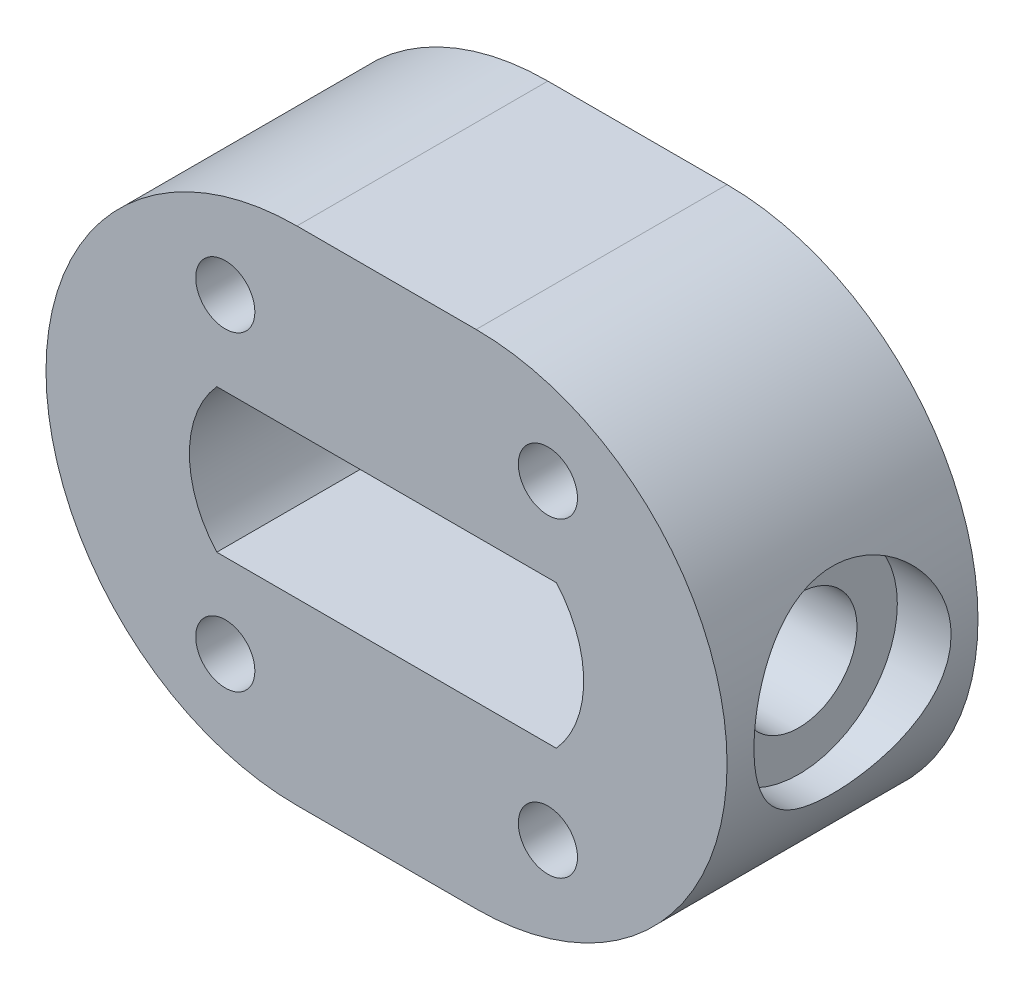
ISO-10303-21;
HEADER;
FILE_DESCRIPTION(('STEP AP214'),'2;1');
FILE_NAME('part.step','',(''),(''),'','','');
FILE_SCHEMA(('AUTOMOTIVE_DESIGN { 1 0 10303 214 1 1 1 1 }'));
ENDSEC;
DATA;
#1=APPLICATION_CONTEXT('core data for automotive mechanical design processes');
#2=APPLICATION_PROTOCOL_DEFINITION('international standard','automotive_design',2000,#1);
#3=PRODUCT_CONTEXT('',#1,'mechanical');
#4=PRODUCT('Part','Part','',(#3));
#5=PRODUCT_RELATED_PRODUCT_CATEGORY('part','',(#4));
#6=PRODUCT_DEFINITION_FORMATION('','',#4);
#7=PRODUCT_DEFINITION_CONTEXT('part definition',#1,'design');
#8=PRODUCT_DEFINITION('design','',#6,#7);
#9=PRODUCT_DEFINITION_SHAPE('','',#8);
#10=(LENGTH_UNIT() NAMED_UNIT(*) SI_UNIT(.MILLI.,.METRE.));
#11=(NAMED_UNIT(*) PLANE_ANGLE_UNIT() SI_UNIT($,.RADIAN.));
#12=(NAMED_UNIT(*) SI_UNIT($,.STERADIAN.) SOLID_ANGLE_UNIT());
#13=UNCERTAINTY_MEASURE_WITH_UNIT(LENGTH_MEASURE(1.E-05),#10,'distance_accuracy_value','');
#14=(GEOMETRIC_REPRESENTATION_CONTEXT(3) GLOBAL_UNCERTAINTY_ASSIGNED_CONTEXT((#13)) GLOBAL_UNIT_ASSIGNED_CONTEXT((#10,
#11,#12)) REPRESENTATION_CONTEXT('',''));
#15=CARTESIAN_POINT('',(0.,0.,0.));
#16=DIRECTION('',(0.,0.,1.));
#17=DIRECTION('',(1.,0.,0.));
#18=AXIS2_PLACEMENT_3D('',#15,#16,#17);
#19=CARTESIAN_POINT('',(-14.001,0.,7.));
#20=DIRECTION('',(1.,0.,0.));
#21=DIRECTION('',(0.,0.,-1.));
#22=AXIS2_PLACEMENT_3D('',#19,#20,#21);
#23=CYLINDRICAL_SURFACE('',#22,3.25);
#24=CARTESIAN_POINT('',(16.,0.,3.75));
#25=CARTESIAN_POINT('',(15.9999999968418,0.0845895908075062,3.75000010710502));
#26=CARTESIAN_POINT('',(15.9982057317706,0.169174298855041,3.75330807348516));
#27=CARTESIAN_POINT('',(15.9910849054716,0.337688629168005,3.76648436960841));
#28=CARTESIAN_POINT('',(15.9857572154543,0.421618033417977,3.77635479580016));
#29=CARTESIAN_POINT('',(15.9646281992296,0.671619529354527,3.81569072488422));
#30=CARTESIAN_POINT('',(15.9436810456761,0.83584986201363,3.85488078067001));
#31=CARTESIAN_POINT('',(15.890228866877,1.15376713922682,3.95711275144786));
#32=CARTESIAN_POINT('',(15.8577710836472,1.30749416066155,4.02005724007268));
#33=CARTESIAN_POINT('',(15.7841861710609,1.60194414960438,4.16744168732277));
#34=CARTESIAN_POINT('',(15.743058833723,1.74266680502315,4.25188216164366));
#35=CARTESIAN_POINT('',(15.6525266172162,2.01774841509847,4.44628806500437));
#36=CARTESIAN_POINT('',(15.6027505241037,2.15103789526043,4.55759100392271));
#37=CARTESIAN_POINT('',(15.5015607025277,2.39805786589936,4.79959434769888));
#38=CARTESIAN_POINT('',(15.4501455411072,2.511770652944,4.93031211272945));
#39=CARTESIAN_POINT('',(15.3457684273913,2.72734741522894,5.22236438993163));
#40=CARTESIAN_POINT('',(15.2931221092154,2.82706536799265,5.38542674592848));
#41=CARTESIAN_POINT('',(15.2222945253322,2.95466052067836,5.64291301082421));
#42=CARTESIAN_POINT('',(15.2000363642127,2.99353772792408,5.73092146063458));
#43=CARTESIAN_POINT('',(15.1591007943765,3.0635471596076,5.91074805246237));
#44=CARTESIAN_POINT('',(15.1404211085523,3.09468431308904,6.00256372625367));
#45=CARTESIAN_POINT('',(15.1084931288596,3.14709111519756,6.1835245271104));
#46=CARTESIAN_POINT('',(15.0949790126333,3.16885455658121,6.27247981309386));
#47=CARTESIAN_POINT('',(15.0724146410805,3.20484972725021,6.45241481582031));
#48=CARTESIAN_POINT('',(15.0633618016427,3.21908581696315,6.5433933286515));
#49=CARTESIAN_POINT('',(15.0501459574101,3.23978101859309,6.72651132346652));
#50=CARTESIAN_POINT('',(15.0459786131393,3.24624703230451,6.81864970156391));
#51=CARTESIAN_POINT('',(15.0427149441598,3.25131114903461,7.00319958545221));
#52=CARTESIAN_POINT('',(15.0436179666448,3.2499102649112,7.09561105455167));
#53=CARTESIAN_POINT('',(15.0529111674355,3.2354715912382,7.34484167321289));
#54=CARTESIAN_POINT('',(15.0661320206671,3.21492441770593,7.50112623873217));
#55=CARTESIAN_POINT('',(15.1055123205931,3.15199409501766,7.80744119054964));
#56=CARTESIAN_POINT('',(15.1316773021115,3.1096016046249,7.95746887166361));
#57=CARTESIAN_POINT('',(15.1944450324272,3.00359709639858,8.25133471176817));
#58=CARTESIAN_POINT('',(15.2312652798265,2.93953765902187,8.39496335510454));
#59=CARTESIAN_POINT('',(15.3112666167694,2.7923923132744,8.67015961549609));
#60=CARTESIAN_POINT('',(15.3544504904518,2.70929806815014,8.80172191234293));
#61=CARTESIAN_POINT('',(15.4502288211475,2.51173030854548,9.07015278914436));
#62=CARTESIAN_POINT('',(15.5032548719704,2.3944051660883,9.20477811741815));
#63=CARTESIAN_POINT('',(15.6075137185624,2.13889621579862,9.45345960133974));
#64=CARTESIAN_POINT('',(15.6587453378153,2.00069902733752,9.56750245830558));
#65=CARTESIAN_POINT('',(15.7575772851938,1.69628046383966,9.77875392829248));
#66=CARTESIAN_POINT('',(15.8047431947595,1.52883965066175,9.87444220725959));
#67=CARTESIAN_POINT('',(15.8657764155714,1.26525514491597,9.99516477207735));
#68=CARTESIAN_POINT('',(15.8845053727505,1.17529656979969,10.0316108876032));
#69=CARTESIAN_POINT('',(15.9181812146247,0.991865019508263,10.0964728806318));
#70=CARTESIAN_POINT('',(15.933130399649,0.898394221816171,10.1248936435148));
#71=CARTESIAN_POINT('',(15.9575956384993,0.717374561293706,10.1710867955075));
#72=CARTESIAN_POINT('',(15.9674826324485,0.63006214204146,10.1895934790975));
#73=CARTESIAN_POINT('',(15.9834588734351,0.453910702281236,10.2193848229783));
#74=CARTESIAN_POINT('',(15.9895500599047,0.365072485248027,10.2306731714868));
#75=CARTESIAN_POINT('',(15.9977621393416,0.186603366519969,10.2458732661232));
#76=CARTESIAN_POINT('',(15.9998841567425,0.0969726965521414,10.2497871013935));
#77=CARTESIAN_POINT('',(16.0001068517641,-0.0822827900354111,10.2501962989701));
#78=CARTESIAN_POINT('',(15.9982077739607,-0.171907606679579,10.2466921124641));
#79=CARTESIAN_POINT('',(15.9872627718936,-0.422760906089683,10.2264498164209));
#80=CARTESIAN_POINT('',(15.9736751811719,-0.583208902303486,10.2012937289034));
#81=CARTESIAN_POINT('',(15.9346695951574,-0.897103465735874,10.1278985818742));
#82=CARTESIAN_POINT('',(15.9092503863193,-1.05054931298502,10.0796571545313));
#83=CARTESIAN_POINT('',(15.848076103199,-1.35055178809212,9.96060174498583));
#84=CARTESIAN_POINT('',(15.8120898446414,-1.49685817327782,9.88927877470983));
#85=CARTESIAN_POINT('',(15.7330204526739,-1.77582089071237,9.72673153281912));
#86=CARTESIAN_POINT('',(15.6899346358449,-1.90847203076993,9.63549973202105));
#87=CARTESIAN_POINT('',(15.595050388838,-2.1718861540554,9.42424173823536));
#88=CARTESIAN_POINT('',(15.5428147992635,-2.30084086829031,9.3021533349725));
#89=CARTESIAN_POINT('',(15.4386061383063,-2.53738135175453,9.03853853162149));
#90=CARTESIAN_POINT('',(15.3866333740943,-2.64494607122073,8.89699321344747));
#91=CARTESIAN_POINT('',(15.2847826491906,-2.84330896800733,8.5857081030556));
#92=CARTESIAN_POINT('',(15.2353291456487,-2.93232819356049,8.41466868598338));
#93=CARTESIAN_POINT('',(15.1714749318883,-3.04263904554347,8.14639682107057));
#94=CARTESIAN_POINT('',(15.1519103905631,-3.07554086317977,8.05501527107985));
#95=CARTESIAN_POINT('',(15.1170542572984,-3.13319210455392,7.86894807637777));
#96=CARTESIAN_POINT('',(15.1017597171188,-3.15794715538259,7.77426476244739));
#97=CARTESIAN_POINT('',(15.0774274995154,-3.1969055621627,7.59172818661525));
#98=CARTESIAN_POINT('',(15.067926388356,-3.21190025393025,7.50410477591605));
#99=CARTESIAN_POINT('',(15.0534237158459,-3.23467031305389,7.32759705149574));
#100=CARTESIAN_POINT('',(15.0484196542712,-3.24244969198343,7.23871346635133));
#101=CARTESIAN_POINT('',(15.0431375718569,-3.25065994435187,7.06049758786957));
#102=CARTESIAN_POINT('',(15.0428576157234,-3.25109382697303,6.97116549327363));
#103=CARTESIAN_POINT('',(15.0470215673247,-3.24462307571876,6.79290672482824));
#104=CARTESIAN_POINT('',(15.0514651265624,-3.2377189832332,6.70398002155546));
#105=CARTESIAN_POINT('',(15.0698841611098,-3.20886316620398,6.46183152052536));
#106=CARTESIAN_POINT('',(15.0884815771928,-3.17955423426101,6.30976447836814));
#107=CARTESIAN_POINT('',(15.137109695176,-3.100356839236,6.01311985307843));
#108=CARTESIAN_POINT('',(15.1671448472532,-3.05046036535266,5.86854520998286));
#109=CARTESIAN_POINT('',(15.2374996469691,-2.92811720054425,5.58063119415423));
#110=CARTESIAN_POINT('',(15.2783480328421,-2.85444782366893,5.43794353363067));
#111=CARTESIAN_POINT('',(15.3651092113456,-2.68782769102069,5.16600255766775));
#112=CARTESIAN_POINT('',(15.4110247128521,-2.59486659830248,5.03675650051165));
#113=CARTESIAN_POINT('',(15.5110075669371,-2.37599792285706,4.7750362909937));
#114=CARTESIAN_POINT('',(15.5652605870474,-2.24723645023535,4.64501123820005));
#115=CARTESIAN_POINT('',(15.6698134028037,-1.96858047674876,4.40757655220657));
#116=CARTESIAN_POINT('',(15.7201104902498,-1.81867169139898,4.30018232886735));
#117=CARTESIAN_POINT('',(15.7893953539864,-1.57803476225943,4.15722218945696));
#118=CARTESIAN_POINT('',(15.8117429819918,-1.49383684613579,4.1120703082536));
#119=CARTESIAN_POINT('',(15.853402379464,-1.32119134444301,4.02912296182062));
#120=CARTESIAN_POINT('',(15.8727156403106,-1.23274587461656,3.99132388052899));
#121=CARTESIAN_POINT('',(15.9076970080242,-1.05239697811493,3.92360240002022));
#122=CARTESIAN_POINT('',(15.923372259836,-0.960500748410063,3.89366454611113));
#123=CARTESIAN_POINT('',(15.9506294953016,-0.773881656228695,3.84199848338353));
#124=CARTESIAN_POINT('',(15.9622136858248,-0.679160347702714,3.8202658479293));
#125=CARTESIAN_POINT('',(15.9809342717151,-0.487551651646231,3.78530038997896));
#126=CARTESIAN_POINT('',(15.9880628577392,-0.390660767557397,3.77208249003444));
#127=CARTESIAN_POINT('',(15.9975957257043,-0.195844408621937,3.7544322293444));
#128=CARTESIAN_POINT('',(16.0000000036559,-0.0979189329017312,3.74999987601774));
#129=CARTESIAN_POINT('',(16.,0.,3.75));
#130=B_SPLINE_CURVE_WITH_KNOTS('',3,(#24,#25,#26,#27,#28,#29,#30,#31,#32,#33,#34,#35,#36,#37,
#38,#39,#40,#41,#42,#43,#44,#45,#46,#47,#48,#49,#50,#51,#52,#53,#54,#55,#56,#57,#58,#59,#60,#61,
#62,#63,#64,#65,#66,#67,#68,#69,#70,#71,#72,#73,#74,#75,#76,#77,#78,#79,#80,#81,#82,#83,#84,#85,
#86,#87,#88,#89,#90,#91,#92,#93,#94,#95,#96,#97,#98,#99,#100,#101,#102,#103,#104,#105,#106,#107,
#108,#109,#110,#111,#112,#113,#114,#115,#116,#117,#118,#119,#120,#121,#122,#123,#124,#125,#126,
#127,#128,#129),.UNSPECIFIED.,.T.,.F.,(4,2,2,2,2,2,2,2,2,2,2,2,2,2,2,2,2,2,2,2,2,2,2,2,2,2,2,2,
2,2,2,2,2,2,2,2,2,2,2,2,2,2,2,2,2,2,2,2,2,2,2,2,4),(0.,0.253667625547999,0.507416326920462,
1.01507657090669,1.52067693618148,2.02628943211511,2.56600598570491,3.10620807639375,
3.69763448213053,3.99354137727862,4.28925934657677,4.5665590479976,4.84369793938993,
5.12059047889653,5.39744736948795,5.86953536619279,6.34182539931799,6.82453285208106,
7.30745212380514,7.86391684710063,8.42073983443947,9.01276998596605,9.30894847828436,
9.60494628329879,9.87397341138578,10.1428629696426,10.4116763421105,10.6804733649659,
11.1669105208213,11.6533975805531,12.1514411325034,12.6496733635396,13.2026388242641,
13.7561457908684,14.3497476356443,14.6465819665667,14.943210837247,15.21102841913,
15.4786970102364,15.7462559446171,16.0137951400865,16.4794597401546,16.9453057057199,
17.4405017253511,17.9359637706881,18.5060965534712,19.0766163074225,19.3706289777998,
19.664496686941,19.9577822699354,20.2509094013432,20.5445488668302,20.838188580278),.UNSPECIFIED.);
#131=CARTESIAN_POINT('',(16.,0.,3.75));
#132=VERTEX_POINT('',#131);
#133=EDGE_CURVE('E172',#132,#132,#130,.T.);
#134=ORIENTED_EDGE('',*,*,#133,.F.);
#135=EDGE_LOOP('',(#134));
#136=FACE_BOUND('',#135,.T.);
#137=CARTESIAN_POINT('',(21.,0.,7.));
#138=DIRECTION('',(1.,0.,0.));
#139=DIRECTION('',(0.,0.,-1.));
#140=AXIS2_PLACEMENT_3D('',#137,#138,#139);
#141=CIRCLE('',#140,3.25);
#142=CARTESIAN_POINT('',(21.,0.,3.75));
#143=VERTEX_POINT('',#142);
#144=EDGE_CURVE('E170',#143,#143,#141,.F.);
#145=ORIENTED_EDGE('',*,*,#144,.F.);
#146=EDGE_LOOP('',(#145));
#147=FACE_BOUND('',#146,.T.);
#148=ADVANCED_FACE('F35',(#136,#147),#23,.F.);
#149=CARTESIAN_POINT('',(0.,0.,14.));
#150=DIRECTION('',(0.,0.,1.));
#151=DIRECTION('',(1.,0.,0.));
#152=AXIS2_PLACEMENT_3D('',#149,#150,#151);
#153=PLANE('',#152);
#154=CARTESIAN_POINT('',(-3.99694790543473,8.67467578644874,14.));
#155=DIRECTION('',(0.,0.,1.));
#156=DIRECTION('',(1.,0.,0.));
#157=AXIS2_PLACEMENT_3D('',#154,#155,#156);
#158=CIRCLE('',#157,1.64999999999999);
#159=CARTESIAN_POINT('',(-2.34694790543474,8.67467578644874,14.));
#160=VERTEX_POINT('',#159);
#161=EDGE_CURVE('E177',#160,#160,#158,.T.);
#162=ORIENTED_EDGE('',*,*,#161,.F.);
#163=EDGE_LOOP('',(#162));
#164=FACE_BOUND('',#163,.T.);
#165=CARTESIAN_POINT('',(14.0030520945653,8.67467578644874,14.));
#166=DIRECTION('',(0.,0.,1.));
#167=DIRECTION('',(1.,0.,0.));
#168=AXIS2_PLACEMENT_3D('',#165,#166,#167);
#169=CIRCLE('',#168,1.64999999999999);
#170=CARTESIAN_POINT('',(15.6530520945653,8.67467578644874,14.));
#171=VERTEX_POINT('',#170);
#172=EDGE_CURVE('E400',#171,#171,#169,.T.);
#173=ORIENTED_EDGE('',*,*,#172,.F.);
#174=EDGE_LOOP('',(#173));
#175=FACE_BOUND('',#174,.T.);
#176=CARTESIAN_POINT('',(14.0030520945653,-8.67467578644874,14.));
#177=DIRECTION('',(0.,0.,1.));
#178=DIRECTION('',(1.,0.,0.));
#179=AXIS2_PLACEMENT_3D('',#176,#177,#178);
#180=CIRCLE('',#179,1.64999999999999);
#181=CARTESIAN_POINT('',(15.6530520945653,-8.67467578644874,14.));
#182=VERTEX_POINT('',#181);
#183=EDGE_CURVE('E396',#182,#182,#180,.T.);
#184=ORIENTED_EDGE('',*,*,#183,.F.);
#185=EDGE_LOOP('',(#184));
#186=FACE_BOUND('',#185,.T.);
#187=CARTESIAN_POINT('',(-3.99694790543473,-8.67467578644874,14.));
#188=DIRECTION('',(0.,0.,1.));
#189=DIRECTION('',(1.,0.,0.));
#190=AXIS2_PLACEMENT_3D('',#187,#188,#189);
#191=CIRCLE('',#190,1.64999999999999);
#192=CARTESIAN_POINT('',(-2.34694790543474,-8.67467578644874,14.));
#193=VERTEX_POINT('',#192);
#194=EDGE_CURVE('E391',#193,#193,#191,.T.);
#195=ORIENTED_EDGE('',*,*,#194,.F.);
#196=EDGE_LOOP('',(#195));
#197=FACE_BOUND('',#196,.T.);
#198=CARTESIAN_POINT('',(0.,0.,14.));
#199=DIRECTION('',(0.,0.,1.));
#200=DIRECTION('',(1.,0.,0.));
#201=AXIS2_PLACEMENT_3D('',#198,#199,#200);
#202=CIRCLE('',#201,14.);
#203=CARTESIAN_POINT('',(0.,14.,14.));
#204=VERTEX_POINT('',#203);
#205=CARTESIAN_POINT('',(0.,-14.,14.));
#206=VERTEX_POINT('',#205);
#207=EDGE_CURVE('E143',#204,#206,#202,.T.);
#208=ORIENTED_EDGE('',*,*,#207,.T.);
#209=DIRECTION('',(1.,0.,0.));
#210=VECTOR('',#209,1.);
#211=CARTESIAN_POINT('',(0.,-14.,14.));
#212=LINE('',#211,#210);
#213=CARTESIAN_POINT('',(10.,-14.,14.));
#214=VERTEX_POINT('',#213);
#215=EDGE_CURVE('E146',#206,#214,#212,.T.);
#216=ORIENTED_EDGE('',*,*,#215,.T.);
#217=CARTESIAN_POINT('',(10.,0.,14.));
#218=DIRECTION('',(0.,0.,1.));
#219=DIRECTION('',(1.,0.,0.));
#220=AXIS2_PLACEMENT_3D('',#217,#218,#219);
#221=CIRCLE('',#220,14.);
#222=CARTESIAN_POINT('',(10.,14.,14.));
#223=VERTEX_POINT('',#222);
#224=EDGE_CURVE('E149',#214,#223,#221,.T.);
#225=ORIENTED_EDGE('',*,*,#224,.T.);
#226=DIRECTION('',(-1.,0.,0.));
#227=VECTOR('',#226,1.);
#228=CARTESIAN_POINT('',(0.,14.,14.));
#229=LINE('',#228,#227);
#230=EDGE_CURVE('E151',#223,#204,#229,.T.);
#231=ORIENTED_EDGE('',*,*,#230,.T.);
#232=EDGE_LOOP('',(#208,#216,#225,#231));
#233=FACE_BOUND('',#232,.T.);
#234=DIRECTION('',(1.,0.,0.));
#235=VECTOR('',#234,1.);
#236=CARTESIAN_POINT('',(-4.47213595499958,-4.,14.));
#237=LINE('',#236,#235);
#238=CARTESIAN_POINT('',(-4.47213595499958,-4.,14.));
#239=VERTEX_POINT('',#238);
#240=CARTESIAN_POINT('',(14.4721359549996,-4.,14.));
#241=VERTEX_POINT('',#240);
#242=EDGE_CURVE('E112',#239,#241,#237,.T.);
#243=ORIENTED_EDGE('',*,*,#242,.F.);
#244=CARTESIAN_POINT('',(0.,0.,14.));
#245=DIRECTION('',(0.,0.,1.));
#246=DIRECTION('',(1.,0.,0.));
#247=AXIS2_PLACEMENT_3D('',#244,#245,#246);
#248=CIRCLE('',#247,6.);
#249=CARTESIAN_POINT('',(-4.47213595499958,4.,14.));
#250=VERTEX_POINT('',#249);
#251=EDGE_CURVE('E104',#250,#239,#248,.T.);
#252=ORIENTED_EDGE('',*,*,#251,.F.);
#253=DIRECTION('',(-1.,0.,0.));
#254=VECTOR('',#253,1.);
#255=CARTESIAN_POINT('',(-4.47213595499958,4.,14.));
#256=LINE('',#255,#254);
#257=CARTESIAN_POINT('',(14.4721359549996,4.,14.));
#258=VERTEX_POINT('',#257);
#259=EDGE_CURVE('E127',#258,#250,#256,.T.);
#260=ORIENTED_EDGE('',*,*,#259,.F.);
#261=CARTESIAN_POINT('',(10.,0.,14.));
#262=DIRECTION('',(0.,0.,1.));
#263=DIRECTION('',(1.,0.,0.));
#264=AXIS2_PLACEMENT_3D('',#261,#262,#263);
#265=CIRCLE('',#264,6.);
#266=EDGE_CURVE('E125',#241,#258,#265,.T.);
#267=ORIENTED_EDGE('',*,*,#266,.F.);
#268=EDGE_LOOP('',(#243,#252,#260,#267));
#269=FACE_BOUND('',#268,.T.);
#270=ADVANCED_FACE('F124',(#164,#175,#186,#197,#233,#269),#153,.T.);
#271=CARTESIAN_POINT('',(0.,0.,0.));
#272=DIRECTION('',(0.,0.,1.));
#273=DIRECTION('',(1.,0.,0.));
#274=AXIS2_PLACEMENT_3D('',#271,#272,#273);
#275=PLANE('',#274);
#276=CARTESIAN_POINT('',(-3.99694790543473,8.67467578644874,0.));
#277=DIRECTION('',(0.,0.,1.));
#278=DIRECTION('',(1.,0.,0.));
#279=AXIS2_PLACEMENT_3D('',#276,#277,#278);
#280=CIRCLE('',#279,1.65);
#281=CARTESIAN_POINT('',(-2.34694790543473,8.67467578644874,0.));
#282=VERTEX_POINT('',#281);
#283=EDGE_CURVE('E380',#282,#282,#280,.T.);
#284=ORIENTED_EDGE('',*,*,#283,.T.);
#285=EDGE_LOOP('',(#284));
#286=FACE_BOUND('',#285,.T.);
#287=CARTESIAN_POINT('',(14.0030520945653,8.67467578644874,0.));
#288=DIRECTION('',(0.,0.,1.));
#289=DIRECTION('',(1.,0.,0.));
#290=AXIS2_PLACEMENT_3D('',#287,#288,#289);
#291=CIRCLE('',#290,1.65);
#292=CARTESIAN_POINT('',(15.6530520945653,8.67467578644874,0.));
#293=VERTEX_POINT('',#292);
#294=EDGE_CURVE('E384',#293,#293,#291,.T.);
#295=ORIENTED_EDGE('',*,*,#294,.T.);
#296=EDGE_LOOP('',(#295));
#297=FACE_BOUND('',#296,.T.);
#298=CARTESIAN_POINT('',(14.0030520945653,-8.67467578644874,0.));
#299=DIRECTION('',(0.,0.,1.));
#300=DIRECTION('',(1.,0.,0.));
#301=AXIS2_PLACEMENT_3D('',#298,#299,#300);
#302=CIRCLE('',#301,1.65);
#303=CARTESIAN_POINT('',(15.6530520945653,-8.67467578644874,0.));
#304=VERTEX_POINT('',#303);
#305=EDGE_CURVE('E388',#304,#304,#302,.T.);
#306=ORIENTED_EDGE('',*,*,#305,.T.);
#307=EDGE_LOOP('',(#306));
#308=FACE_BOUND('',#307,.T.);
#309=CARTESIAN_POINT('',(-3.99694790543473,-8.67467578644874,0.));
#310=DIRECTION('',(0.,0.,1.));
#311=DIRECTION('',(1.,0.,0.));
#312=AXIS2_PLACEMENT_3D('',#309,#310,#311);
#313=CIRCLE('',#312,1.65);
#314=CARTESIAN_POINT('',(-2.34694790543473,-8.67467578644874,0.));
#315=VERTEX_POINT('',#314);
#316=EDGE_CURVE('E133',#315,#315,#313,.T.);
#317=ORIENTED_EDGE('',*,*,#316,.T.);
#318=EDGE_LOOP('',(#317));
#319=FACE_BOUND('',#318,.T.);
#320=CARTESIAN_POINT('',(0.,0.,0.));
#321=DIRECTION('',(0.,0.,1.));
#322=DIRECTION('',(1.,0.,0.));
#323=AXIS2_PLACEMENT_3D('',#320,#321,#322);
#324=CIRCLE('',#323,14.);
#325=CARTESIAN_POINT('',(0.,14.,0.));
#326=VERTEX_POINT('',#325);
#327=CARTESIAN_POINT('',(0.,-14.,0.));
#328=VERTEX_POINT('',#327);
#329=EDGE_CURVE('E120',#326,#328,#324,.T.);
#330=ORIENTED_EDGE('',*,*,#329,.F.);
#331=DIRECTION('',(-1.,0.,0.));
#332=VECTOR('',#331,1.);
#333=CARTESIAN_POINT('',(0.,14.,0.));
#334=LINE('',#333,#332);
#335=CARTESIAN_POINT('',(10.,14.,0.));
#336=VERTEX_POINT('',#335);
#337=EDGE_CURVE('E147',#336,#326,#334,.T.);
#338=ORIENTED_EDGE('',*,*,#337,.F.);
#339=CARTESIAN_POINT('',(10.,0.,0.));
#340=DIRECTION('',(0.,0.,1.));
#341=DIRECTION('',(1.,0.,0.));
#342=AXIS2_PLACEMENT_3D('',#339,#340,#341);
#343=CIRCLE('',#342,14.);
#344=CARTESIAN_POINT('',(10.,-14.,0.));
#345=VERTEX_POINT('',#344);
#346=EDGE_CURVE('E158',#345,#336,#343,.T.);
#347=ORIENTED_EDGE('',*,*,#346,.F.);
#348=DIRECTION('',(1.,0.,0.));
#349=VECTOR('',#348,1.);
#350=CARTESIAN_POINT('',(0.,-14.,0.));
#351=LINE('',#350,#349);
#352=EDGE_CURVE('E156',#328,#345,#351,.T.);
#353=ORIENTED_EDGE('',*,*,#352,.F.);
#354=EDGE_LOOP('',(#330,#338,#347,#353));
#355=FACE_BOUND('',#354,.T.);
#356=CARTESIAN_POINT('',(0.,0.,0.));
#357=DIRECTION('',(0.,0.,1.));
#358=DIRECTION('',(1.,0.,0.));
#359=AXIS2_PLACEMENT_3D('',#356,#357,#358);
#360=CIRCLE('',#359,6.);
#361=CARTESIAN_POINT('',(-4.47213595499958,4.,0.));
#362=VERTEX_POINT('',#361);
#363=CARTESIAN_POINT('',(-4.47213595499958,-4.,0.));
#364=VERTEX_POINT('',#363);
#365=EDGE_CURVE('E62',#362,#364,#360,.T.);
#366=ORIENTED_EDGE('',*,*,#365,.T.);
#367=DIRECTION('',(1.,0.,0.));
#368=VECTOR('',#367,1.);
#369=CARTESIAN_POINT('',(-4.47213595499958,-4.,0.));
#370=LINE('',#369,#368);
#371=CARTESIAN_POINT('',(14.4721359549996,-4.,0.));
#372=VERTEX_POINT('',#371);
#373=EDGE_CURVE('E119',#364,#372,#370,.T.);
#374=ORIENTED_EDGE('',*,*,#373,.T.);
#375=CARTESIAN_POINT('',(10.,0.,0.));
#376=DIRECTION('',(0.,0.,1.));
#377=DIRECTION('',(1.,0.,0.));
#378=AXIS2_PLACEMENT_3D('',#375,#376,#377);
#379=CIRCLE('',#378,6.);
#380=CARTESIAN_POINT('',(14.4721359549996,4.,0.));
#381=VERTEX_POINT('',#380);
#382=EDGE_CURVE('E135',#372,#381,#379,.T.);
#383=ORIENTED_EDGE('',*,*,#382,.T.);
#384=DIRECTION('',(-1.,0.,0.));
#385=VECTOR('',#384,1.);
#386=CARTESIAN_POINT('',(-4.47213595499958,4.,0.));
#387=LINE('',#386,#385);
#388=EDGE_CURVE('E113',#381,#362,#387,.T.);
#389=ORIENTED_EDGE('',*,*,#388,.T.);
#390=EDGE_LOOP('',(#366,#374,#383,#389));
#391=FACE_BOUND('',#390,.T.);
#392=ADVANCED_FACE('F223',(#286,#297,#308,#319,#355,#391),#275,.F.);
#393=CARTESIAN_POINT('',(0.,0.,14.));
#394=DIRECTION('',(0.,0.,-1.));
#395=DIRECTION('',(-1.,0.,0.));
#396=AXIS2_PLACEMENT_3D('',#393,#394,#395);
#397=CYLINDRICAL_SURFACE('',#396,14.);
#398=ORIENTED_EDGE('',*,*,#329,.T.);
#399=DIRECTION('',(0.,0.,-1.));
#400=VECTOR('',#399,1.);
#401=CARTESIAN_POINT('',(0.,-14.,14.));
#402=LINE('',#401,#400);
#403=EDGE_CURVE('E47',#206,#328,#402,.T.);
#404=ORIENTED_EDGE('',*,*,#403,.F.);
#405=ORIENTED_EDGE('',*,*,#207,.F.);
#406=DIRECTION('',(0.,0.,-1.));
#407=VECTOR('',#406,1.);
#408=CARTESIAN_POINT('',(0.,14.,14.));
#409=LINE('',#408,#407);
#410=EDGE_CURVE('E153',#204,#326,#409,.T.);
#411=ORIENTED_EDGE('',*,*,#410,.T.);
#412=EDGE_LOOP('',(#398,#404,#405,#411));
#413=FACE_BOUND('',#412,.T.);
#414=ADVANCED_FACE('F37',(#413),#397,.T.);
#415=CARTESIAN_POINT('',(0.,-14.,14.));
#416=DIRECTION('',(0.,1.,0.));
#417=DIRECTION('',(0.,0.,1.));
#418=AXIS2_PLACEMENT_3D('',#415,#416,#417);
#419=PLANE('',#418);
#420=ORIENTED_EDGE('',*,*,#352,.T.);
#421=DIRECTION('',(0.,0.,-1.));
#422=VECTOR('',#421,1.);
#423=CARTESIAN_POINT('',(10.,-14.,14.));
#424=LINE('',#423,#422);
#425=EDGE_CURVE('E166',#214,#345,#424,.T.);
#426=ORIENTED_EDGE('',*,*,#425,.F.);
#427=ORIENTED_EDGE('',*,*,#215,.F.);
#428=ORIENTED_EDGE('',*,*,#403,.T.);
#429=EDGE_LOOP('',(#420,#426,#427,#428));
#430=FACE_BOUND('',#429,.T.);
#431=ADVANCED_FACE('F233',(#430),#419,.F.);
#432=CARTESIAN_POINT('',(10.,0.,14.));
#433=DIRECTION('',(0.,0.,-1.));
#434=DIRECTION('',(-1.,0.,0.));
#435=AXIS2_PLACEMENT_3D('',#432,#433,#434);
#436=CYLINDRICAL_SURFACE('',#435,14.);
#437=CARTESIAN_POINT('',(24.,0.,1.5));
#438=CARTESIAN_POINT('',(23.9999991981542,-0.148107440135565,1.50000103470651));
#439=CARTESIAN_POINT('',(23.9976432962258,-0.296263489183168,1.50599034229118));
#440=CARTESIAN_POINT('',(23.9882786558791,-0.59152731734669,1.52989421208061));
#441=CARTESIAN_POINT('',(23.981267018253,-0.738634385514194,1.54781620499592));
#442=CARTESIAN_POINT('',(23.9627586955236,-1.0309494701739,1.59545440465356));
#443=CARTESIAN_POINT('',(23.9512529934141,-1.17615305825737,1.62519432528499));
#444=CARTESIAN_POINT('',(23.9240568424281,-1.46337371048899,1.69618692306406));
#445=CARTESIAN_POINT('',(23.9083646961406,-1.60538945673603,1.7374442703148));
#446=CARTESIAN_POINT('',(23.873268693446,-1.8847174832279,1.83091377708768));
#447=CARTESIAN_POINT('',(23.853878348709,-2.02204480356267,1.8830861230318));
#448=CARTESIAN_POINT('',(23.8118308377256,-2.29171634171426,1.99804710309451));
#449=CARTESIAN_POINT('',(23.7891724526966,-2.42405867710566,2.06083969944282));
#450=CARTESIAN_POINT('',(23.7411659056778,-2.68284546314959,2.19649484788773));
#451=CARTESIAN_POINT('',(23.7158197199878,-2.80929415017441,2.26935001288644));
#452=CARTESIAN_POINT('',(23.6630338874978,-3.05571865139357,2.42465058592582));
#453=CARTESIAN_POINT('',(23.6355934849365,-3.17569210188375,2.50709946183171));
#454=CARTESIAN_POINT('',(23.5487701897126,-3.53452365735472,2.77523880913057));
#455=CARTESIAN_POINT('',(23.486931346774,-3.76165823556175,2.97616472265069));
#456=CARTESIAN_POINT('',(23.3632143204062,-4.17998377420555,3.41263811660959));
#457=CARTESIAN_POINT('',(23.3013361319281,-4.37115823001784,3.64820140662829));
#458=CARTESIAN_POINT('',(23.2122144390337,-4.63101202129053,4.02868166008085));
#459=CARTESIAN_POINT('',(23.1825563319966,-4.71455732832135,4.1630908572863));
#460=CARTESIAN_POINT('',(23.1259436459254,-4.86995251394368,4.43902334305122));
#461=CARTESIAN_POINT('',(23.0989879598294,-4.94180718924377,4.58054368252905));
#462=CARTESIAN_POINT('',(23.0486561775943,-5.07321683129151,4.86980865299618));
#463=CARTESIAN_POINT('',(23.0252803717317,-5.13277080076621,5.01755378748907));
#464=CARTESIAN_POINT('',(22.9829303959233,-5.23896833347619,5.31815537468639));
#465=CARTESIAN_POINT('',(22.9639540456377,-5.28561829407271,5.47100925237169));
#466=CARTESIAN_POINT('',(22.9318029453761,-5.36378419201487,5.77394531173065));
#467=CARTESIAN_POINT('',(22.9184109500558,-5.39587227740479,5.92385682961519));
#468=CARTESIAN_POINT('',(22.8967498415471,-5.44744240536092,6.22613595469156));
#469=CARTESIAN_POINT('',(22.8884784366608,-5.46693008735661,6.37850243180479));
#470=CARTESIAN_POINT('',(22.8773509603204,-5.49308977965311,6.68449996123074));
#471=CARTESIAN_POINT('',(22.8744938417555,-5.49976426799973,6.83813076325244));
#472=CARTESIAN_POINT('',(22.8742977969829,-5.50022342063734,7.14541171353261));
#473=CARTESIAN_POINT('',(22.8769586265116,-5.49400865549817,7.29906186063366));
#474=CARTESIAN_POINT('',(22.8873378831308,-5.46961424369828,7.59484978857901));
#475=CARTESIAN_POINT('',(22.89470556941,-5.45226399399934,7.73706926752962));
#476=CARTESIAN_POINT('',(22.9139255877199,-5.40658298899864,8.01947341670785));
#477=CARTESIAN_POINT('',(22.9257793996677,-5.37824861009454,8.15965739958734));
#478=CARTESIAN_POINT('',(22.9536038578634,-5.31088242153117,8.43697075805589));
#479=CARTESIAN_POINT('',(22.9695734924475,-5.27185324049167,8.57410087529524));
#480=CARTESIAN_POINT('',(23.0051664805722,-5.18342692483824,8.8445416430983));
#481=CARTESIAN_POINT('',(23.0247912360475,-5.13402581110356,8.97785080540638));
#482=CARTESIAN_POINT('',(23.0675541371305,-5.02419815525261,9.24239724469006));
#483=CARTESIAN_POINT('',(23.0907536119529,-4.96357447341433,9.37354268520241));
#484=CARTESIAN_POINT('',(23.1397378246257,-4.8324103671432,9.63032392044498));
#485=CARTESIAN_POINT('',(23.1655234379955,-4.76186658105548,9.75595782845277));
#486=CARTESIAN_POINT('',(23.2189974423881,-4.61134300336056,10.0010328860662));
#487=CARTESIAN_POINT('',(23.2466860764534,-4.53136200555077,10.120473241238));
#488=CARTESIAN_POINT('',(23.303267709621,-4.36245348378581,10.3525512482766));
#489=CARTESIAN_POINT('',(23.3321607685854,-4.27352551483904,10.4651885613371));
#490=CARTESIAN_POINT('',(23.3926269061057,-4.080262623132,10.691230778475));
#491=CARTESIAN_POINT('',(23.424239163269,-3.97527329732212,10.8040665294799));
#492=CARTESIAN_POINT('',(23.4871791256907,-3.75619264902287,11.0205378900371));
#493=CARTESIAN_POINT('',(23.5185069127877,-3.64210404305488,11.124176226032));
#494=CARTESIAN_POINT('',(23.5800704772305,-3.40538511553486,11.3217042233787));
#495=CARTESIAN_POINT('',(23.610305629918,-3.28275002170483,11.4155883640159));
#496=CARTESIAN_POINT('',(23.6688486656845,-3.02975668494722,11.5928665025352));
#497=CARTESIAN_POINT('',(23.697157316121,-2.89940155619165,11.6762646884982));
#498=CARTESIAN_POINT('',(23.7516126167432,-2.62916387247048,11.8334657402504));
#499=CARTESIAN_POINT('',(23.7777081170826,-2.48914756345037,11.9070567700959));
#500=CARTESIAN_POINT('',(23.8263717342927,-2.20284301259206,12.0420750734223));
#501=CARTESIAN_POINT('',(23.8489412638599,-2.05655731270511,12.1035072210622));
#502=CARTESIAN_POINT('',(23.8899050169921,-1.75872865921751,12.213643207164));
#503=CARTESIAN_POINT('',(23.9083000118017,-1.60718668268686,12.2623493969962));
#504=CARTESIAN_POINT('',(23.9403687784835,-1.29998489980859,12.3465314766182));
#505=CARTESIAN_POINT('',(23.9540428641746,-1.14432536791333,12.3820082458367));
#506=CARTESIAN_POINT('',(23.9756141254292,-0.839192164179521,12.4376840848811));
#507=CARTESIAN_POINT('',(23.9837981986478,-0.689877274395374,12.4586441549502));
#508=CARTESIAN_POINT('',(23.9953760570104,-0.389848603782045,12.4882363152236));
#509=CARTESIAN_POINT('',(23.9987700675527,-0.239134889111075,12.4968689854989));
#510=CARTESIAN_POINT('',(24.0006727234828,0.0624900698248707,12.5017125870702));
#511=CARTESIAN_POINT('',(23.9991824042084,0.213401265450988,12.49792615086));
#512=CARTESIAN_POINT('',(23.9913604139384,0.514274998794237,12.4779786981489));
#513=CARTESIAN_POINT('',(23.9850288299352,0.664237553508615,12.4618179040019));
#514=CARTESIAN_POINT('',(23.9680768964272,0.955614709172199,12.418261176373));
#515=CARTESIAN_POINT('',(23.9576539431772,1.09711843666216,12.3913815583685));
#516=CARTESIAN_POINT('',(23.9327974477227,1.37729487041791,12.3267003030421));
#517=CARTESIAN_POINT('',(23.9183625906639,1.51596663251824,12.2888950848212));
#518=CARTESIAN_POINT('',(23.8858438794345,1.78949892877072,12.2027157269318));
#519=CARTESIAN_POINT('',(23.8677610322946,1.92436050304097,12.1543445037138));
#520=CARTESIAN_POINT('',(23.8283715820792,2.18954739722974,12.0474083746983));
#521=CARTESIAN_POINT('',(23.8070637537695,2.31987096982505,11.9888395933692));
#522=CARTESIAN_POINT('',(23.761050728826,2.57901451139452,11.8600658910847));
#523=CARTESIAN_POINT('',(23.7362629557883,2.70767281707557,11.789565240133));
#524=CARTESIAN_POINT('',(23.6843988951779,2.95865788802317,11.638727094337));
#525=CARTESIAN_POINT('',(23.6573218238033,3.08098246146718,11.5583862261754));
#526=CARTESIAN_POINT('',(23.6015311239455,3.31862189939353,11.3884044847838));
#527=CARTESIAN_POINT('',(23.5728172287732,3.43393561522856,11.2987620940848));
#528=CARTESIAN_POINT('',(23.5144400478315,3.65693832470116,11.1107269967105));
#529=CARTESIAN_POINT('',(23.4847767226952,3.76462700158031,11.0123339268984));
#530=CARTESIAN_POINT('',(23.4233035572587,3.97845140441909,10.8007847507888));
#531=CARTESIAN_POINT('',(23.3914777681301,4.08404732590813,10.6870869241518));
#532=CARTESIAN_POINT('',(23.3284398001523,4.28530182107753,10.4511197734446));
#533=CARTESIAN_POINT('',(23.2972274316278,4.38096350699444,10.3288531540668));
#534=CARTESIAN_POINT('',(23.2362730645038,4.56181857934004,10.0763516484948));
#535=CARTESIAN_POINT('',(23.2065318826149,4.64700618934705,9.94611242420829));
#536=CARTESIAN_POINT('',(23.1494314218953,4.80620481493838,9.67854771784345));
#537=CARTESIAN_POINT('',(23.1220711435278,4.8802205303214,9.54122524835264));
#538=CARTESIAN_POINT('',(23.0703531200652,5.01709787639911,9.25909662306345));
#539=CARTESIAN_POINT('',(23.0460227862334,5.07985966134419,9.11423690685391));
#540=CARTESIAN_POINT('',(23.0014648865325,5.19284134372029,8.81916036106615));
#541=CARTESIAN_POINT('',(22.9812355499585,5.24306665625247,8.66894587662288));
#542=CARTESIAN_POINT('',(22.9455913902659,5.33046845784917,8.36426285263561));
#543=CARTESIAN_POINT('',(22.9301748090638,5.3676497124808,8.20979588899916));
#544=CARTESIAN_POINT('',(22.9047230918319,5.42855566043556,7.89779741775861));
#545=CARTESIAN_POINT('',(22.8946875277828,5.45228142405019,7.74026615492966));
#546=CARTESIAN_POINT('',(22.8808848625701,5.48480548959804,7.43457577521981));
#547=CARTESIAN_POINT('',(22.8767281965418,5.4945323304796,7.28653237241442));
#548=CARTESIAN_POINT('',(22.8735434414134,5.50199032807812,6.9900348362112));
#549=CARTESIAN_POINT('',(22.8745170762804,5.4997174524551,6.84158058150345));
#550=CARTESIAN_POINT('',(22.8815622891468,5.48319544545711,6.54553747102657));
#551=CARTESIAN_POINT('',(22.8876313616665,5.4689522000343,6.39794822583195));
#552=CARTESIAN_POINT('',(22.9046598378969,5.42864912705919,6.10462554192043));
#553=CARTESIAN_POINT('',(22.9156210842631,5.40258484701029,5.95889282376421));
#554=CARTESIAN_POINT('',(22.941579069515,5.34009647766283,5.67576815865656));
#555=CARTESIAN_POINT('',(22.9564102566844,5.30409450830345,5.53826774171351));
#556=CARTESIAN_POINT('',(22.9898265259923,5.22172122321566,5.266860867133));
#557=CARTESIAN_POINT('',(23.0084129151577,5.17534629649613,5.13295567927738));
#558=CARTESIAN_POINT('',(23.069033708178,5.021216334048,4.73788848970667));
#559=CARTESIAN_POINT('',(23.1159498792322,4.89841008801181,4.4831684716174));
#560=CARTESIAN_POINT('',(23.2207258949875,4.60840703886931,3.98323470994145));
#561=CARTESIAN_POINT('',(23.2790509345219,4.43911229370191,3.73934863606364));
#562=CARTESIAN_POINT('',(23.3986487625072,4.06384829543448,3.2821371137242));
#563=CARTESIAN_POINT('',(23.4599225672209,3.85786633142517,3.06882230357012));
#564=CARTESIAN_POINT('',(23.5512880057766,3.51817475313023,2.76949273501215));
#565=CARTESIAN_POINT('',(23.582537854332,3.39582392397283,2.6706630198672));
#566=CARTESIAN_POINT('',(23.6432930642306,3.14284037506126,2.4836674628978));
#567=CARTESIAN_POINT('',(23.6727990584085,3.0122106957611,2.39549774032722));
#568=CARTESIAN_POINT('',(23.7292660033103,2.74338053099188,2.23043325776863));
#569=CARTESIAN_POINT('',(23.7562253622764,2.60517539469478,2.15354553312483));
#570=CARTESIAN_POINT('',(23.8068071447097,2.32222138593126,2.01178309566614));
#571=CARTESIAN_POINT('',(23.830431179903,2.17747571898831,1.94690257587408));
#572=CARTESIAN_POINT('',(23.871846770359,1.89486436412232,1.83467166144989));
#573=CARTESIAN_POINT('',(23.8899623383175,1.75744940412509,1.78630377067174));
#574=CARTESIAN_POINT('',(23.9223791015108,1.4788546058126,1.70054559006145));
#575=CARTESIAN_POINT('',(23.9366820020872,1.33767648188423,1.66315039157328));
#576=CARTESIAN_POINT('',(23.9610917912342,1.05276647231419,1.59972790037189));
#577=CARTESIAN_POINT('',(23.9712078759231,0.909040914469384,1.57367568677684));
#578=CARTESIAN_POINT('',(23.9870229127276,0.619792363678084,1.53308472037094));
#579=CARTESIAN_POINT('',(23.9927244918003,0.47427049213564,1.51853912016271));
#580=CARTESIAN_POINT('',(23.9974307420132,0.273733010618965,1.50654274738403));
#581=CARTESIAN_POINT('',(23.9983936702459,0.219023218214992,1.50408991389245));
#582=CARTESIAN_POINT('',(23.9996784643353,0.109544502071859,1.50081830599031));
#583=CARTESIAN_POINT('',(24.0000002965521,0.054775575380636,1.4999996173275));
#584=CARTESIAN_POINT('',(24.,0.,1.5));
#585=B_SPLINE_CURVE_WITH_KNOTS('',3,(#437,#438,#439,#440,#441,#442,#443,#444,#445,#446,#447,
#448,#449,#450,#451,#452,#453,#454,#455,#456,#457,#458,#459,#460,#461,#462,#463,#464,#465,#466,
#467,#468,#469,#470,#471,#472,#473,#474,#475,#476,#477,#478,#479,#480,#481,#482,#483,#484,#485,
#486,#487,#488,#489,#490,#491,#492,#493,#494,#495,#496,#497,#498,#499,#500,#501,#502,#503,#504,
#505,#506,#507,#508,#509,#510,#511,#512,#513,#514,#515,#516,#517,#518,#519,#520,#521,#522,#523,
#524,#525,#526,#527,#528,#529,#530,#531,#532,#533,#534,#535,#536,#537,#538,#539,#540,#541,#542,
#543,#544,#545,#546,#547,#548,#549,#550,#551,#552,#553,#554,#555,#556,#557,#558,#559,#560,#561,
#562,#563,#564,#565,#566,#567,#568,#569,#570,#571,#572,#573,#574,#575,#576,#577,#578,#579,#580,
#581,#582,#583,#584),.UNSPECIFIED.,.T.,.F.,(4,2,2,2,2,2,2,2,2,2,2,2,2,2,2,2,2,2,2,2,2,2,2,2,2,2,
2,2,2,2,2,2,2,2,2,2,2,2,2,2,2,2,2,2,2,2,2,2,2,2,2,2,2,2,2,2,2,2,2,2,2,2,2,2,2,2,2,2,2,2,2,2,2,
4),(0.,0.444267504960509,0.888811922834347,1.33425290608311,1.77987477040322,2.2238986712904,
2.66808859663215,3.11195415107451,3.55598065219085,4.48013105942975,5.40470459470028,
5.88723395882026,6.36956483736278,6.8519348052792,7.33406520048568,7.79513180861253,
8.25599191892789,8.71676289084458,9.17751346620274,9.60739908795678,10.0374266474055,
10.4673486072741,10.8974358061241,11.3359536253514,11.774620406113,12.2133433152468,
12.6520880557474,13.1235514072386,13.5948745300129,14.0664629771547,14.5378624699113,
15.0181970572458,15.498338700015,15.9783915643616,16.4584125113963,16.9108396440771,
17.3632454869076,17.8155554388937,18.2678572635438,18.7005910937268,19.1334669149176,
19.5662234034809,19.9991447194366,20.4450194589257,20.8910474784639,21.3371483786551,
21.783267799854,22.2579191595233,22.7324213670745,23.2071840984503,23.6817465463751,
24.1603308596784,24.6387080904201,25.1169103665009,25.5950745995519,26.0397725738643,
26.484619992335,26.9292488027108,27.3740452257016,27.8022711297045,28.2306463385928,
29.0867668431246,29.990751635182,30.8950502395288,31.3756329998461,31.8560402749053,
32.3367458656061,32.8172183643327,33.2571301534563,33.6968448460682,34.135588536486,
34.5740709408938,34.7383687733693,34.9026752267443),.UNSPECIFIED.);
#586=CARTESIAN_POINT('',(24.,0.,1.5));
#587=VERTEX_POINT('',#586);
#588=EDGE_CURVE('E11',#587,#587,#585,.T.);
#589=ORIENTED_EDGE('',*,*,#588,.T.);
#590=EDGE_LOOP('',(#589));
#591=FACE_BOUND('',#590,.T.);
#592=ORIENTED_EDGE('',*,*,#346,.T.);
#593=DIRECTION('',(0.,0.,-1.));
#594=VECTOR('',#593,1.);
#595=CARTESIAN_POINT('',(10.,14.,14.));
#596=LINE('',#595,#594);
#597=EDGE_CURVE('E163',#223,#336,#596,.T.);
#598=ORIENTED_EDGE('',*,*,#597,.F.);
#599=ORIENTED_EDGE('',*,*,#224,.F.);
#600=ORIENTED_EDGE('',*,*,#425,.T.);
#601=EDGE_LOOP('',(#592,#598,#599,#600));
#602=FACE_BOUND('',#601,.T.);
#603=ADVANCED_FACE('F229',(#591,#602),#436,.T.);
#604=CARTESIAN_POINT('',(0.,14.,14.));
#605=DIRECTION('',(0.,-1.,0.));
#606=DIRECTION('',(0.,0.,-1.));
#607=AXIS2_PLACEMENT_3D('',#604,#605,#606);
#608=PLANE('',#607);
#609=ORIENTED_EDGE('',*,*,#337,.T.);
#610=ORIENTED_EDGE('',*,*,#410,.F.);
#611=ORIENTED_EDGE('',*,*,#230,.F.);
#612=ORIENTED_EDGE('',*,*,#597,.T.);
#613=EDGE_LOOP('',(#609,#610,#611,#612));
#614=FACE_BOUND('',#613,.T.);
#615=ADVANCED_FACE('F220',(#614),#608,.F.);
#616=CARTESIAN_POINT('',(0.,0.,14.));
#617=DIRECTION('',(0.,0.,-1.));
#618=DIRECTION('',(-1.,0.,0.));
#619=AXIS2_PLACEMENT_3D('',#616,#617,#618);
#620=CYLINDRICAL_SURFACE('',#619,6.);
#621=ORIENTED_EDGE('',*,*,#365,.F.);
#622=DIRECTION('',(0.,0.,-1.));
#623=VECTOR('',#622,1.);
#624=CARTESIAN_POINT('',(-4.47213595499958,4.,14.));
#625=LINE('',#624,#623);
#626=EDGE_CURVE('E108',#250,#362,#625,.T.);
#627=ORIENTED_EDGE('',*,*,#626,.F.);
#628=ORIENTED_EDGE('',*,*,#251,.T.);
#629=DIRECTION('',(0.,0.,-1.));
#630=VECTOR('',#629,1.);
#631=CARTESIAN_POINT('',(-4.47213595499958,-4.,14.));
#632=LINE('',#631,#630);
#633=EDGE_CURVE('E107',#239,#364,#632,.T.);
#634=ORIENTED_EDGE('',*,*,#633,.T.);
#635=EDGE_LOOP('',(#621,#627,#628,#634));
#636=FACE_BOUND('',#635,.T.);
#637=ADVANCED_FACE('F106',(#636),#620,.F.);
#638=CARTESIAN_POINT('',(-4.47213595499958,-4.,14.));
#639=DIRECTION('',(0.,1.,0.));
#640=DIRECTION('',(0.,0.,1.));
#641=AXIS2_PLACEMENT_3D('',#638,#639,#640);
#642=PLANE('',#641);
#643=ORIENTED_EDGE('',*,*,#373,.F.);
#644=ORIENTED_EDGE('',*,*,#633,.F.);
#645=ORIENTED_EDGE('',*,*,#242,.T.);
#646=DIRECTION('',(0.,0.,-1.));
#647=VECTOR('',#646,1.);
#648=CARTESIAN_POINT('',(14.4721359549996,-4.,14.));
#649=LINE('',#648,#647);
#650=EDGE_CURVE('E121',#241,#372,#649,.T.);
#651=ORIENTED_EDGE('',*,*,#650,.T.);
#652=EDGE_LOOP('',(#643,#644,#645,#651));
#653=FACE_BOUND('',#652,.T.);
#654=ADVANCED_FACE('F116',(#653),#642,.T.);
#655=CARTESIAN_POINT('',(10.,0.,14.));
#656=DIRECTION('',(0.,0.,-1.));
#657=DIRECTION('',(-1.,0.,0.));
#658=AXIS2_PLACEMENT_3D('',#655,#656,#657);
#659=CYLINDRICAL_SURFACE('',#658,6.);
#660=ORIENTED_EDGE('',*,*,#133,.T.);
#661=EDGE_LOOP('',(#660));
#662=FACE_BOUND('',#661,.T.);
#663=ORIENTED_EDGE('',*,*,#382,.F.);
#664=ORIENTED_EDGE('',*,*,#650,.F.);
#665=ORIENTED_EDGE('',*,*,#266,.T.);
#666=DIRECTION('',(0.,0.,-1.));
#667=VECTOR('',#666,1.);
#668=CARTESIAN_POINT('',(14.4721359549996,4.,14.));
#669=LINE('',#668,#667);
#670=EDGE_CURVE('E54',#258,#381,#669,.T.);
#671=ORIENTED_EDGE('',*,*,#670,.T.);
#672=EDGE_LOOP('',(#663,#664,#665,#671));
#673=FACE_BOUND('',#672,.T.);
#674=ADVANCED_FACE('F212',(#662,#673),#659,.F.);
#675=CARTESIAN_POINT('',(-4.47213595499958,4.,14.));
#676=DIRECTION('',(0.,-1.,0.));
#677=DIRECTION('',(0.,0.,-1.));
#678=AXIS2_PLACEMENT_3D('',#675,#676,#677);
#679=PLANE('',#678);
#680=ORIENTED_EDGE('',*,*,#388,.F.);
#681=ORIENTED_EDGE('',*,*,#670,.F.);
#682=ORIENTED_EDGE('',*,*,#259,.T.);
#683=ORIENTED_EDGE('',*,*,#626,.T.);
#684=EDGE_LOOP('',(#680,#681,#682,#683));
#685=FACE_BOUND('',#684,.T.);
#686=ADVANCED_FACE('F208',(#685),#679,.T.);
#687=CARTESIAN_POINT('',(-3.99694790543473,-8.67467578644874,14.));
#688=DIRECTION('',(0.,0.,1.));
#689=DIRECTION('',(1.,0.,0.));
#690=AXIS2_PLACEMENT_3D('',#687,#688,#689);
#691=CYLINDRICAL_SURFACE('',#690,1.64999999999999);
#692=ORIENTED_EDGE('',*,*,#316,.F.);
#693=EDGE_LOOP('',(#692));
#694=FACE_BOUND('',#693,.T.);
#695=ORIENTED_EDGE('',*,*,#194,.T.);
#696=EDGE_LOOP('',(#695));
#697=FACE_BOUND('',#696,.T.);
#698=ADVANCED_FACE('F204',(#694,#697),#691,.F.);
#699=CARTESIAN_POINT('',(14.0030520945653,-8.67467578644874,14.));
#700=DIRECTION('',(0.,0.,1.));
#701=DIRECTION('',(1.,0.,0.));
#702=AXIS2_PLACEMENT_3D('',#699,#700,#701);
#703=CYLINDRICAL_SURFACE('',#702,1.64999999999999);
#704=ORIENTED_EDGE('',*,*,#305,.F.);
#705=EDGE_LOOP('',(#704));
#706=FACE_BOUND('',#705,.T.);
#707=ORIENTED_EDGE('',*,*,#183,.T.);
#708=EDGE_LOOP('',(#707));
#709=FACE_BOUND('',#708,.T.);
#710=ADVANCED_FACE('F200',(#706,#709),#703,.F.);
#711=CARTESIAN_POINT('',(14.0030520945653,8.67467578644874,14.));
#712=DIRECTION('',(0.,0.,1.));
#713=DIRECTION('',(1.,0.,0.));
#714=AXIS2_PLACEMENT_3D('',#711,#712,#713);
#715=CYLINDRICAL_SURFACE('',#714,1.64999999999999);
#716=ORIENTED_EDGE('',*,*,#294,.F.);
#717=EDGE_LOOP('',(#716));
#718=FACE_BOUND('',#717,.T.);
#719=ORIENTED_EDGE('',*,*,#172,.T.);
#720=EDGE_LOOP('',(#719));
#721=FACE_BOUND('',#720,.T.);
#722=ADVANCED_FACE('F196',(#718,#721),#715,.F.);
#723=CARTESIAN_POINT('',(-3.99694790543473,8.67467578644874,14.));
#724=DIRECTION('',(0.,0.,1.));
#725=DIRECTION('',(1.,0.,0.));
#726=AXIS2_PLACEMENT_3D('',#723,#724,#725);
#727=CYLINDRICAL_SURFACE('',#726,1.64999999999999);
#728=ORIENTED_EDGE('',*,*,#283,.F.);
#729=EDGE_LOOP('',(#728));
#730=FACE_BOUND('',#729,.T.);
#731=ORIENTED_EDGE('',*,*,#161,.T.);
#732=EDGE_LOOP('',(#731));
#733=FACE_BOUND('',#732,.T.);
#734=ADVANCED_FACE('F192',(#730,#733),#727,.F.);
#735=CARTESIAN_POINT('',(21.,0.,7.));
#736=DIRECTION('',(1.,0.,0.));
#737=DIRECTION('',(0.,0.,-1.));
#738=AXIS2_PLACEMENT_3D('',#735,#736,#737);
#739=CYLINDRICAL_SURFACE('',#738,5.5);
#740=CARTESIAN_POINT('',(21.,0.,7.));
#741=DIRECTION('',(1.,0.,0.));
#742=DIRECTION('',(0.,0.,-1.));
#743=AXIS2_PLACEMENT_3D('',#740,#741,#742);
#744=CIRCLE('',#743,5.5);
#745=CARTESIAN_POINT('',(21.,0.,1.5));
#746=VERTEX_POINT('',#745);
#747=EDGE_CURVE('E173',#746,#746,#744,.T.);
#748=ORIENTED_EDGE('',*,*,#747,.F.);
#749=EDGE_LOOP('',(#748));
#750=FACE_BOUND('',#749,.T.);
#751=ORIENTED_EDGE('',*,*,#588,.F.);
#752=EDGE_LOOP('',(#751));
#753=FACE_BOUND('',#752,.T.);
#754=ADVANCED_FACE('F195',(#750,#753),#739,.F.);
#755=CARTESIAN_POINT('',(21.,0.,7.));
#756=DIRECTION('',(1.,0.,0.));
#757=DIRECTION('',(0.,0.,-1.));
#758=AXIS2_PLACEMENT_3D('',#755,#756,#757);
#759=PLANE('',#758);
#760=ORIENTED_EDGE('',*,*,#747,.T.);
#761=EDGE_LOOP('',(#760));
#762=FACE_BOUND('',#761,.T.);
#763=ORIENTED_EDGE('',*,*,#144,.T.);
#764=EDGE_LOOP('',(#763));
#765=FACE_BOUND('',#764,.T.);
#766=ADVANCED_FACE('F320',(#762,#765),#759,.T.);
#767=CLOSED_SHELL('',(#148,#270,#392,#414,#431,#603,#615,#637,#654,#674,#686,#698,#710,#722,
#734,#754,#766));
#768=MANIFOLD_SOLID_BREP('B2',#767);
#769=ADVANCED_BREP_SHAPE_REPRESENTATION('',(#18,#768),#14);
#770=SHAPE_DEFINITION_REPRESENTATION(#9,#769);
ENDSEC;
END-ISO-10303-21;
